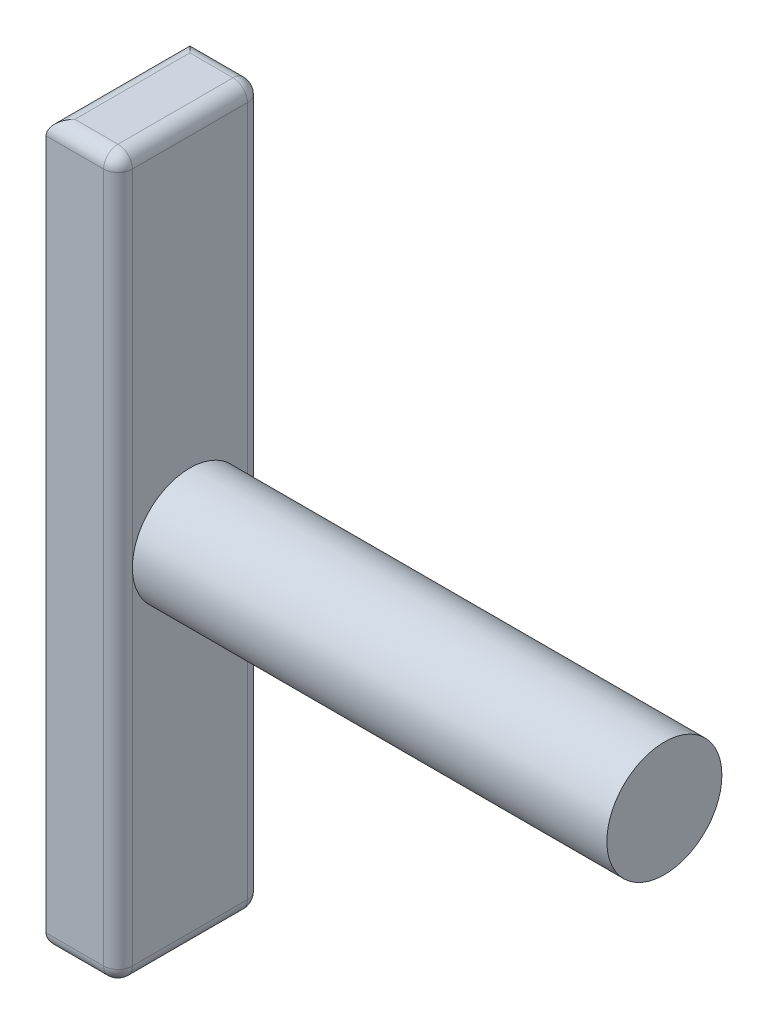
ISO-10303-21;
HEADER;
FILE_DESCRIPTION(('STEP AP214'),'2;1');
FILE_NAME('part.step','',(''),(''),'','','');
FILE_SCHEMA(('AUTOMOTIVE_DESIGN { 1 0 10303 214 1 1 1 1 }'));
ENDSEC;
DATA;
#1=APPLICATION_CONTEXT('core data for automotive mechanical design processes');
#2=APPLICATION_PROTOCOL_DEFINITION('international standard','automotive_design',2000,#1);
#3=PRODUCT_CONTEXT('',#1,'mechanical');
#4=PRODUCT('Part','Part','',(#3));
#5=PRODUCT_RELATED_PRODUCT_CATEGORY('part','',(#4));
#6=PRODUCT_DEFINITION_FORMATION('','',#4);
#7=PRODUCT_DEFINITION_CONTEXT('part definition',#1,'design');
#8=PRODUCT_DEFINITION('design','',#6,#7);
#9=PRODUCT_DEFINITION_SHAPE('','',#8);
#10=(LENGTH_UNIT() NAMED_UNIT(*) SI_UNIT(.MILLI.,.METRE.));
#11=(NAMED_UNIT(*) PLANE_ANGLE_UNIT() SI_UNIT($,.RADIAN.));
#12=(NAMED_UNIT(*) SI_UNIT($,.STERADIAN.) SOLID_ANGLE_UNIT());
#13=UNCERTAINTY_MEASURE_WITH_UNIT(LENGTH_MEASURE(1.E-05),#10,'distance_accuracy_value','');
#14=(GEOMETRIC_REPRESENTATION_CONTEXT(3) GLOBAL_UNCERTAINTY_ASSIGNED_CONTEXT((#13)) GLOBAL_UNIT_ASSIGNED_CONTEXT((#10,
#11,#12)) REPRESENTATION_CONTEXT('',''));
#15=CARTESIAN_POINT('',(0.,0.,0.));
#16=DIRECTION('',(0.,0.,1.));
#17=DIRECTION('',(1.,0.,0.));
#18=AXIS2_PLACEMENT_3D('',#15,#16,#17);
#19=CARTESIAN_POINT('',(50.,0.,0.));
#20=DIRECTION('',(1.,0.,0.));
#21=DIRECTION('',(0.,0.,-1.));
#22=AXIS2_PLACEMENT_3D('',#19,#20,#21);
#23=PLANE('',#22);
#24=DIRECTION('',(0.,1.,0.));
#25=VECTOR('',#24,1.);
#26=CARTESIAN_POINT('',(50.,-10.,-90.));
#27=LINE('',#26,#25);
#28=CARTESIAN_POINT('',(50.,-490.,-90.0000000000001));
#29=VERTEX_POINT('',#28);
#30=CARTESIAN_POINT('',(50.,-250.,-90.));
#31=VERTEX_POINT('',#30);
#32=EDGE_CURVE('E136',#29,#31,#27,.T.);
#33=ORIENTED_EDGE('',*,*,#32,.T.);
#34=CARTESIAN_POINT('',(50.,-250.,-50.));
#35=DIRECTION('',(1.,0.,0.));
#36=DIRECTION('',(0.,0.,-1.));
#37=AXIS2_PLACEMENT_3D('',#34,#35,#36);
#38=CIRCLE('',#37,40.);
#39=CARTESIAN_POINT('',(50.,-250.,-10.));
#40=VERTEX_POINT('',#39);
#41=EDGE_CURVE('E55',#40,#31,#38,.T.);
#42=ORIENTED_EDGE('',*,*,#41,.F.);
#43=DIRECTION('',(0.,-1.,0.));
#44=VECTOR('',#43,1.);
#45=CARTESIAN_POINT('',(50.,-490.,-10.0000000000001));
#46=LINE('',#45,#44);
#47=CARTESIAN_POINT('',(50.,-490.,-10.0000000000001));
#48=VERTEX_POINT('',#47);
#49=EDGE_CURVE('E133',#40,#48,#46,.T.);
#50=ORIENTED_EDGE('',*,*,#49,.T.);
#51=DIRECTION('',(0.,0.,-1.));
#52=VECTOR('',#51,1.);
#53=CARTESIAN_POINT('',(50.,-490.,-100.));
#54=LINE('',#53,#52);
#55=EDGE_CURVE('E214',#48,#29,#54,.T.);
#56=ORIENTED_EDGE('',*,*,#55,.T.);
#57=EDGE_LOOP('',(#33,#42,#50,#56));
#58=FACE_BOUND('',#57,.T.);
#59=ADVANCED_FACE('F39',(#58),#23,.T.);
#60=CARTESIAN_POINT('',(50.,0.,0.));
#61=DIRECTION('',(0.,0.,-1.));
#62=DIRECTION('',(0.,1.,0.));
#63=AXIS2_PLACEMENT_3D('',#60,#61,#62);
#64=PLANE('',#63);
#65=DIRECTION('',(-1.,0.,0.));
#66=VECTOR('',#65,1.);
#67=CARTESIAN_POINT('',(50.,-490.,0.));
#68=LINE('',#67,#66);
#69=CARTESIAN_POINT('',(0.,-490.,0.));
#70=VERTEX_POINT('',#69);
#71=CARTESIAN_POINT('',(40.,-490.,0.));
#72=VERTEX_POINT('',#71);
#73=EDGE_CURVE('E195',#70,#72,#68,.F.);
#74=ORIENTED_EDGE('',*,*,#73,.T.);
#75=DIRECTION('',(0.,-1.,0.));
#76=VECTOR('',#75,1.);
#77=CARTESIAN_POINT('',(40.,-10.,0.));
#78=LINE('',#77,#76);
#79=CARTESIAN_POINT('',(40.,-10.,0.));
#80=VERTEX_POINT('',#79);
#81=EDGE_CURVE('E11',#72,#80,#78,.F.);
#82=ORIENTED_EDGE('',*,*,#81,.T.);
#83=DIRECTION('',(-1.,0.,0.));
#84=VECTOR('',#83,1.);
#85=CARTESIAN_POINT('',(50.,-10.,0.));
#86=LINE('',#85,#84);
#87=CARTESIAN_POINT('',(0.,-10.,0.));
#88=VERTEX_POINT('',#87);
#89=EDGE_CURVE('E197',#80,#88,#86,.T.);
#90=ORIENTED_EDGE('',*,*,#89,.T.);
#91=DIRECTION('',(0.,-1.,0.));
#92=VECTOR('',#91,1.);
#93=CARTESIAN_POINT('',(0.,0.,0.));
#94=LINE('',#93,#92);
#95=EDGE_CURVE('E172',#88,#70,#94,.T.);
#96=ORIENTED_EDGE('',*,*,#95,.T.);
#97=EDGE_LOOP('',(#74,#82,#90,#96));
#98=FACE_BOUND('',#97,.T.);
#99=ADVANCED_FACE('F263',(#98),#64,.F.);
#100=CARTESIAN_POINT('',(50.,-500.,0.));
#101=DIRECTION('',(0.,1.,0.));
#102=DIRECTION('',(0.,0.,1.));
#103=AXIS2_PLACEMENT_3D('',#100,#101,#102);
#104=PLANE('',#103);
#105=DIRECTION('',(-1.,0.,0.));
#106=VECTOR('',#105,1.);
#107=CARTESIAN_POINT('',(50.,-500.,-10.0000000000001));
#108=LINE('',#107,#106);
#109=CARTESIAN_POINT('',(40.,-500.,-10.0000000000001));
#110=VERTEX_POINT('',#109);
#111=CARTESIAN_POINT('',(10.,-500.,-10.0000000000001));
#112=VERTEX_POINT('',#111);
#113=EDGE_CURVE('E202',#110,#112,#108,.T.);
#114=ORIENTED_EDGE('',*,*,#113,.T.);
#115=DIRECTION('',(0.,0.,-1.));
#116=VECTOR('',#115,1.);
#117=CARTESIAN_POINT('',(10.,-500.,0.));
#118=LINE('',#117,#116);
#119=CARTESIAN_POINT('',(10.,-500.,-90.0000000000001));
#120=VERTEX_POINT('',#119);
#121=EDGE_CURVE('E207',#112,#120,#118,.T.);
#122=ORIENTED_EDGE('',*,*,#121,.T.);
#123=DIRECTION('',(-1.,0.,0.));
#124=VECTOR('',#123,1.);
#125=CARTESIAN_POINT('',(50.,-500.,-90.0000000000001));
#126=LINE('',#125,#124);
#127=CARTESIAN_POINT('',(40.,-500.,-90.0000000000001));
#128=VERTEX_POINT('',#127);
#129=EDGE_CURVE('E204',#120,#128,#126,.F.);
#130=ORIENTED_EDGE('',*,*,#129,.T.);
#131=DIRECTION('',(0.,0.,-1.));
#132=VECTOR('',#131,1.);
#133=CARTESIAN_POINT('',(40.,-500.,0.));
#134=LINE('',#133,#132);
#135=EDGE_CURVE('E199',#128,#110,#134,.F.);
#136=ORIENTED_EDGE('',*,*,#135,.T.);
#137=EDGE_LOOP('',(#114,#122,#130,#136));
#138=FACE_BOUND('',#137,.T.);
#139=ADVANCED_FACE('F268',(#138),#104,.F.);
#140=CARTESIAN_POINT('',(50.,0.,-100.));
#141=DIRECTION('',(0.,0.,1.));
#142=DIRECTION('',(0.,-1.,0.));
#143=AXIS2_PLACEMENT_3D('',#140,#141,#142);
#144=PLANE('',#143);
#145=DIRECTION('',(-1.,0.,0.));
#146=VECTOR('',#145,1.);
#147=CARTESIAN_POINT('',(50.,-10.,-100.));
#148=LINE('',#147,#146);
#149=CARTESIAN_POINT('',(0.,-10.,-100.));
#150=VERTEX_POINT('',#149);
#151=CARTESIAN_POINT('',(40.,-10.,-100.));
#152=VERTEX_POINT('',#151);
#153=EDGE_CURVE('E192',#150,#152,#148,.F.);
#154=ORIENTED_EDGE('',*,*,#153,.T.);
#155=DIRECTION('',(0.,1.,0.));
#156=VECTOR('',#155,1.);
#157=CARTESIAN_POINT('',(40.,-490.,-100.));
#158=LINE('',#157,#156);
#159=CARTESIAN_POINT('',(40.,-490.,-100.));
#160=VERTEX_POINT('',#159);
#161=EDGE_CURVE('E48',#152,#160,#158,.F.);
#162=ORIENTED_EDGE('',*,*,#161,.T.);
#163=DIRECTION('',(-1.,0.,0.));
#164=VECTOR('',#163,1.);
#165=CARTESIAN_POINT('',(50.,-490.,-100.));
#166=LINE('',#165,#164);
#167=CARTESIAN_POINT('',(0.,-490.,-100.));
#168=VERTEX_POINT('',#167);
#169=EDGE_CURVE('E190',#160,#168,#166,.T.);
#170=ORIENTED_EDGE('',*,*,#169,.T.);
#171=DIRECTION('',(0.,1.,0.));
#172=VECTOR('',#171,1.);
#173=CARTESIAN_POINT('',(0.,0.,-100.));
#174=LINE('',#173,#172);
#175=EDGE_CURVE('E175',#168,#150,#174,.T.);
#176=ORIENTED_EDGE('',*,*,#175,.T.);
#177=EDGE_LOOP('',(#154,#162,#170,#176));
#178=FACE_BOUND('',#177,.T.);
#179=ADVANCED_FACE('F279',(#178),#144,.F.);
#180=CARTESIAN_POINT('',(50.,0.,0.));
#181=DIRECTION('',(0.,-1.,0.));
#182=DIRECTION('',(0.,0.,-1.));
#183=AXIS2_PLACEMENT_3D('',#180,#181,#182);
#184=PLANE('',#183);
#185=DIRECTION('',(-1.,0.,0.));
#186=VECTOR('',#185,1.);
#187=CARTESIAN_POINT('',(50.,0.,-10.));
#188=LINE('',#187,#186);
#189=CARTESIAN_POINT('',(10.,0.,-10.));
#190=VERTEX_POINT('',#189);
#191=CARTESIAN_POINT('',(40.,0.,-10.));
#192=VERTEX_POINT('',#191);
#193=EDGE_CURVE('E181',#190,#192,#188,.F.);
#194=ORIENTED_EDGE('',*,*,#193,.T.);
#195=DIRECTION('',(0.,0.,1.));
#196=VECTOR('',#195,1.);
#197=CARTESIAN_POINT('',(40.,0.,-100.));
#198=LINE('',#197,#196);
#199=CARTESIAN_POINT('',(40.,0.,-90.));
#200=VERTEX_POINT('',#199);
#201=EDGE_CURVE('E187',#192,#200,#198,.F.);
#202=ORIENTED_EDGE('',*,*,#201,.T.);
#203=DIRECTION('',(-1.,0.,0.));
#204=VECTOR('',#203,1.);
#205=CARTESIAN_POINT('',(50.,0.,-90.));
#206=LINE('',#205,#204);
#207=CARTESIAN_POINT('',(10.,0.,-90.));
#208=VERTEX_POINT('',#207);
#209=EDGE_CURVE('E184',#200,#208,#206,.T.);
#210=ORIENTED_EDGE('',*,*,#209,.T.);
#211=DIRECTION('',(0.,0.,1.));
#212=VECTOR('',#211,1.);
#213=CARTESIAN_POINT('',(10.,0.,0.));
#214=LINE('',#213,#212);
#215=EDGE_CURVE('E179',#208,#190,#214,.T.);
#216=ORIENTED_EDGE('',*,*,#215,.T.);
#217=EDGE_LOOP('',(#194,#202,#210,#216));
#218=FACE_BOUND('',#217,.T.);
#219=ADVANCED_FACE('F245',(#218),#184,.F.);
#220=CARTESIAN_POINT('',(50.,-10.,-10.));
#221=VERTEX_POINT('',#220);
#222=EDGE_CURVE('E142',#221,#40,#46,.T.);
#223=ORIENTED_EDGE('',*,*,#222,.T.);
#224=EDGE_CURVE('E122',#31,#40,#38,.T.);
#225=ORIENTED_EDGE('',*,*,#224,.F.);
#226=CARTESIAN_POINT('',(50.,-10.,-90.));
#227=VERTEX_POINT('',#226);
#228=EDGE_CURVE('E151',#31,#227,#27,.T.);
#229=ORIENTED_EDGE('',*,*,#228,.T.);
#230=DIRECTION('',(0.,0.,1.));
#231=VECTOR('',#230,1.);
#232=CARTESIAN_POINT('',(50.,-10.,0.));
#233=LINE('',#232,#231);
#234=EDGE_CURVE('E150',#227,#221,#233,.T.);
#235=ORIENTED_EDGE('',*,*,#234,.T.);
#236=EDGE_LOOP('',(#223,#225,#229,#235));
#237=FACE_BOUND('',#236,.T.);
#238=ADVANCED_FACE('F148',(#237),#23,.T.);
#239=CARTESIAN_POINT('',(0.,0.,0.));
#240=DIRECTION('',(1.,0.,0.));
#241=DIRECTION('',(0.,0.,-1.));
#242=AXIS2_PLACEMENT_3D('',#239,#240,#241);
#243=PLANE('',#242);
#244=ORIENTED_EDGE('',*,*,#175,.F.);
#245=DIRECTION('',(0.,0.,-1.));
#246=VECTOR('',#245,1.);
#247=CARTESIAN_POINT('',(0.,-490.,0.));
#248=LINE('',#247,#246);
#249=EDGE_CURVE('E211',#168,#70,#248,.F.);
#250=ORIENTED_EDGE('',*,*,#249,.T.);
#251=ORIENTED_EDGE('',*,*,#95,.F.);
#252=DIRECTION('',(0.,0.,1.));
#253=VECTOR('',#252,1.);
#254=CARTESIAN_POINT('',(0.,-10.,0.));
#255=LINE('',#254,#253);
#256=EDGE_CURVE('E209',#88,#150,#255,.F.);
#257=ORIENTED_EDGE('',*,*,#256,.T.);
#258=EDGE_LOOP('',(#244,#250,#251,#257));
#259=FACE_BOUND('',#258,.T.);
#260=ADVANCED_FACE('F273',(#259),#243,.F.);
#261=CARTESIAN_POINT('',(50.,-10.,-10.));
#262=DIRECTION('',(-1.,0.,0.));
#263=DIRECTION('',(0.,0.,1.));
#264=AXIS2_PLACEMENT_3D('',#261,#262,#263);
#265=CYLINDRICAL_SURFACE('',#264,10.);
#266=ORIENTED_EDGE('',*,*,#89,.F.);
#267=CARTESIAN_POINT('',(40.,-10.,-10.));
#268=DIRECTION('',(-1.,0.,0.));
#269=DIRECTION('',(0.,0.,1.));
#270=AXIS2_PLACEMENT_3D('',#267,#268,#269);
#271=CIRCLE('',#270,10.);
#272=EDGE_CURVE('E237',#80,#192,#271,.T.);
#273=ORIENTED_EDGE('',*,*,#272,.T.);
#274=ORIENTED_EDGE('',*,*,#193,.F.);
#275=CARTESIAN_POINT('',(10.,-10.,-10.));
#276=DIRECTION('',(0.707106781186547,0.,0.707106781186547));
#277=DIRECTION('',(-0.707106781186547,0.,0.707106781186547));
#278=AXIS2_PLACEMENT_3D('',#275,#276,#277);
#279=ELLIPSE('',#278,14.1421356237309,10.);
#280=EDGE_CURVE('E176',#88,#190,#279,.F.);
#281=ORIENTED_EDGE('',*,*,#280,.F.);
#282=EDGE_LOOP('',(#266,#273,#274,#281));
#283=FACE_BOUND('',#282,.T.);
#284=ADVANCED_FACE('F241',(#283),#265,.T.);
#285=CARTESIAN_POINT('',(40.,-10.,0.));
#286=DIRECTION('',(0.,0.,-1.));
#287=DIRECTION('',(-1.,0.,0.));
#288=AXIS2_PLACEMENT_3D('',#285,#286,#287);
#289=CYLINDRICAL_SURFACE('',#288,10.);
#290=ORIENTED_EDGE('',*,*,#234,.F.);
#291=CARTESIAN_POINT('',(40.,-10.,-90.));
#292=DIRECTION('',(0.,0.,-1.));
#293=DIRECTION('',(-1.,0.,0.));
#294=AXIS2_PLACEMENT_3D('',#291,#292,#293);
#295=CIRCLE('',#294,10.);
#296=EDGE_CURVE('E236',#227,#200,#295,.F.);
#297=ORIENTED_EDGE('',*,*,#296,.T.);
#298=ORIENTED_EDGE('',*,*,#201,.F.);
#299=CARTESIAN_POINT('',(40.,-10.,-10.));
#300=DIRECTION('',(0.,0.,-1.));
#301=DIRECTION('',(-1.,0.,0.));
#302=AXIS2_PLACEMENT_3D('',#299,#300,#301);
#303=CIRCLE('',#302,10.);
#304=EDGE_CURVE('E234',#192,#221,#303,.T.);
#305=ORIENTED_EDGE('',*,*,#304,.T.);
#306=EDGE_LOOP('',(#290,#297,#298,#305));
#307=FACE_BOUND('',#306,.T.);
#308=ADVANCED_FACE('F249',(#307),#289,.T.);
#309=CARTESIAN_POINT('',(10.,-10.,0.));
#310=DIRECTION('',(0.,0.,1.));
#311=DIRECTION('',(1.,0.,0.));
#312=AXIS2_PLACEMENT_3D('',#309,#310,#311);
#313=CYLINDRICAL_SURFACE('',#312,10.);
#314=ORIENTED_EDGE('',*,*,#280,.T.);
#315=ORIENTED_EDGE('',*,*,#215,.F.);
#316=CARTESIAN_POINT('',(10.,-10.,-90.));
#317=DIRECTION('',(-0.707106781186547,0.,0.707106781186547));
#318=DIRECTION('',(0.707106781186547,0.,0.707106781186547));
#319=AXIS2_PLACEMENT_3D('',#316,#317,#318);
#320=ELLIPSE('',#319,14.1421356237309,10.);
#321=EDGE_CURVE('E217',#150,#208,#320,.F.);
#322=ORIENTED_EDGE('',*,*,#321,.F.);
#323=ORIENTED_EDGE('',*,*,#256,.F.);
#324=EDGE_LOOP('',(#314,#315,#322,#323));
#325=FACE_BOUND('',#324,.T.);
#326=ADVANCED_FACE('F294',(#325),#313,.T.);
#327=CARTESIAN_POINT('',(50.,-10.,-90.));
#328=DIRECTION('',(-1.,0.,0.));
#329=DIRECTION('',(0.,0.,1.));
#330=AXIS2_PLACEMENT_3D('',#327,#328,#329);
#331=CYLINDRICAL_SURFACE('',#330,10.);
#332=ORIENTED_EDGE('',*,*,#209,.F.);
#333=CARTESIAN_POINT('',(40.,-10.,-90.));
#334=DIRECTION('',(-1.,0.,0.));
#335=DIRECTION('',(0.,0.,1.));
#336=AXIS2_PLACEMENT_3D('',#333,#334,#335);
#337=CIRCLE('',#336,10.);
#338=EDGE_CURVE('E232',#200,#152,#337,.T.);
#339=ORIENTED_EDGE('',*,*,#338,.T.);
#340=ORIENTED_EDGE('',*,*,#153,.F.);
#341=ORIENTED_EDGE('',*,*,#321,.T.);
#342=EDGE_LOOP('',(#332,#339,#340,#341));
#343=FACE_BOUND('',#342,.T.);
#344=ADVANCED_FACE('F290',(#343),#331,.T.);
#345=CARTESIAN_POINT('',(50.,-490.,-10.0000000000001));
#346=DIRECTION('',(-1.,0.,0.));
#347=DIRECTION('',(0.,0.,1.));
#348=AXIS2_PLACEMENT_3D('',#345,#346,#347);
#349=CYLINDRICAL_SURFACE('',#348,10.);
#350=ORIENTED_EDGE('',*,*,#113,.F.);
#351=CARTESIAN_POINT('',(40.,-490.,-10.0000000000001));
#352=DIRECTION('',(-1.,0.,0.));
#353=DIRECTION('',(0.,0.,1.));
#354=AXIS2_PLACEMENT_3D('',#351,#352,#353);
#355=CIRCLE('',#354,10.);
#356=EDGE_CURVE('E63',#110,#72,#355,.T.);
#357=ORIENTED_EDGE('',*,*,#356,.T.);
#358=ORIENTED_EDGE('',*,*,#73,.F.);
#359=CARTESIAN_POINT('',(10.,-490.,-10.0000000000001));
#360=DIRECTION('',(-0.707106781186547,0.,-0.707106781186547));
#361=DIRECTION('',(0.707106781186547,0.,-0.707106781186547));
#362=AXIS2_PLACEMENT_3D('',#359,#360,#361);
#363=ELLIPSE('',#362,14.1421356237309,10.);
#364=EDGE_CURVE('E219',#112,#70,#363,.T.);
#365=ORIENTED_EDGE('',*,*,#364,.F.);
#366=EDGE_LOOP('',(#350,#357,#358,#365));
#367=FACE_BOUND('',#366,.T.);
#368=ADVANCED_FACE('F293',(#367),#349,.T.);
#369=CARTESIAN_POINT('',(40.,-490.,0.));
#370=DIRECTION('',(0.,0.,1.));
#371=DIRECTION('',(1.,0.,0.));
#372=AXIS2_PLACEMENT_3D('',#369,#370,#371);
#373=CYLINDRICAL_SURFACE('',#372,10.);
#374=ORIENTED_EDGE('',*,*,#135,.F.);
#375=CARTESIAN_POINT('',(40.,-490.,-90.0000000000001));
#376=DIRECTION('',(0.,0.,1.));
#377=DIRECTION('',(1.,0.,0.));
#378=AXIS2_PLACEMENT_3D('',#375,#376,#377);
#379=CIRCLE('',#378,10.);
#380=EDGE_CURVE('E230',#128,#29,#379,.T.);
#381=ORIENTED_EDGE('',*,*,#380,.T.);
#382=ORIENTED_EDGE('',*,*,#55,.F.);
#383=CARTESIAN_POINT('',(40.,-490.,-10.0000000000001));
#384=DIRECTION('',(0.,0.,1.));
#385=DIRECTION('',(1.,0.,0.));
#386=AXIS2_PLACEMENT_3D('',#383,#384,#385);
#387=CIRCLE('',#386,10.);
#388=EDGE_CURVE('E228',#48,#110,#387,.F.);
#389=ORIENTED_EDGE('',*,*,#388,.T.);
#390=EDGE_LOOP('',(#374,#381,#382,#389));
#391=FACE_BOUND('',#390,.T.);
#392=ADVANCED_FACE('F311',(#391),#373,.T.);
#393=CARTESIAN_POINT('',(10.,-490.,0.));
#394=DIRECTION('',(0.,0.,-1.));
#395=DIRECTION('',(-1.,0.,0.));
#396=AXIS2_PLACEMENT_3D('',#393,#394,#395);
#397=CYLINDRICAL_SURFACE('',#396,10.);
#398=ORIENTED_EDGE('',*,*,#364,.T.);
#399=ORIENTED_EDGE('',*,*,#249,.F.);
#400=CARTESIAN_POINT('',(10.,-490.,-90.0000000000001));
#401=DIRECTION('',(0.707106781186547,0.,-0.707106781186547));
#402=DIRECTION('',(-0.707106781186547,0.,-0.707106781186547));
#403=AXIS2_PLACEMENT_3D('',#400,#401,#402);
#404=ELLIPSE('',#403,14.1421356237309,10.);
#405=EDGE_CURVE('E162',#120,#168,#404,.T.);
#406=ORIENTED_EDGE('',*,*,#405,.F.);
#407=ORIENTED_EDGE('',*,*,#121,.F.);
#408=EDGE_LOOP('',(#398,#399,#406,#407));
#409=FACE_BOUND('',#408,.T.);
#410=ADVANCED_FACE('F307',(#409),#397,.T.);
#411=CARTESIAN_POINT('',(50.,-490.,-90.0000000000001));
#412=DIRECTION('',(-1.,0.,0.));
#413=DIRECTION('',(0.,0.,1.));
#414=AXIS2_PLACEMENT_3D('',#411,#412,#413);
#415=CYLINDRICAL_SURFACE('',#414,10.);
#416=ORIENTED_EDGE('',*,*,#169,.F.);
#417=CARTESIAN_POINT('',(40.,-490.,-90.0000000000001));
#418=DIRECTION('',(-1.,0.,0.));
#419=DIRECTION('',(0.,0.,1.));
#420=AXIS2_PLACEMENT_3D('',#417,#418,#419);
#421=CIRCLE('',#420,10.);
#422=EDGE_CURVE('E216',#160,#128,#421,.T.);
#423=ORIENTED_EDGE('',*,*,#422,.T.);
#424=ORIENTED_EDGE('',*,*,#129,.F.);
#425=ORIENTED_EDGE('',*,*,#405,.T.);
#426=EDGE_LOOP('',(#416,#423,#424,#425));
#427=FACE_BOUND('',#426,.T.);
#428=ADVANCED_FACE('F303',(#427),#415,.T.);
#429=CARTESIAN_POINT('',(40.,-10.,-90.));
#430=DIRECTION('',(0.,0.,1.));
#431=DIRECTION('',(1.,0.,0.));
#432=AXIS2_PLACEMENT_3D('',#429,#430,#431);
#433=SPHERICAL_SURFACE('',#432,10.);
#434=ORIENTED_EDGE('',*,*,#338,.F.);
#435=ORIENTED_EDGE('',*,*,#296,.F.);
#436=CARTESIAN_POINT('',(40.,-10.,-90.));
#437=DIRECTION('',(0.,-1.,0.));
#438=DIRECTION('',(0.,0.,-1.));
#439=AXIS2_PLACEMENT_3D('',#436,#437,#438);
#440=CIRCLE('',#439,10.);
#441=EDGE_CURVE('E160',#152,#227,#440,.T.);
#442=ORIENTED_EDGE('',*,*,#441,.F.);
#443=EDGE_LOOP('',(#434,#435,#442));
#444=FACE_BOUND('',#443,.T.);
#445=ADVANCED_FACE('F306',(#444),#433,.T.);
#446=CARTESIAN_POINT('',(40.,0.,-90.));
#447=DIRECTION('',(0.,-1.,0.));
#448=DIRECTION('',(0.,0.,-1.));
#449=AXIS2_PLACEMENT_3D('',#446,#447,#448);
#450=CYLINDRICAL_SURFACE('',#449,10.);
#451=ORIENTED_EDGE('',*,*,#441,.T.);
#452=ORIENTED_EDGE('',*,*,#228,.F.);
#453=ORIENTED_EDGE('',*,*,#32,.F.);
#454=CARTESIAN_POINT('',(40.,-490.,-90.0000000000001));
#455=DIRECTION('',(0.,-1.,0.));
#456=DIRECTION('',(0.,0.,-1.));
#457=AXIS2_PLACEMENT_3D('',#454,#455,#456);
#458=CIRCLE('',#457,10.);
#459=EDGE_CURVE('E157',#160,#29,#458,.T.);
#460=ORIENTED_EDGE('',*,*,#459,.F.);
#461=ORIENTED_EDGE('',*,*,#161,.F.);
#462=EDGE_LOOP('',(#451,#452,#453,#460,#461));
#463=FACE_BOUND('',#462,.T.);
#464=ADVANCED_FACE('F321',(#463),#450,.T.);
#465=CARTESIAN_POINT('',(40.,-490.,-90.0000000000001));
#466=DIRECTION('',(0.,0.,1.));
#467=DIRECTION('',(1.,0.,0.));
#468=AXIS2_PLACEMENT_3D('',#465,#466,#467);
#469=SPHERICAL_SURFACE('',#468,10.);
#470=ORIENTED_EDGE('',*,*,#459,.T.);
#471=ORIENTED_EDGE('',*,*,#380,.F.);
#472=ORIENTED_EDGE('',*,*,#422,.F.);
#473=EDGE_LOOP('',(#470,#471,#472));
#474=FACE_BOUND('',#473,.T.);
#475=ADVANCED_FACE('F318',(#474),#469,.T.);
#476=CARTESIAN_POINT('',(40.,-490.,-10.0000000000001));
#477=DIRECTION('',(0.,0.,1.));
#478=DIRECTION('',(1.,0.,0.));
#479=AXIS2_PLACEMENT_3D('',#476,#477,#478);
#480=SPHERICAL_SURFACE('',#479,10.);
#481=ORIENTED_EDGE('',*,*,#356,.F.);
#482=ORIENTED_EDGE('',*,*,#388,.F.);
#483=CARTESIAN_POINT('',(40.,-490.,-10.0000000000001));
#484=DIRECTION('',(0.,1.,0.));
#485=DIRECTION('',(0.,0.,1.));
#486=AXIS2_PLACEMENT_3D('',#483,#484,#485);
#487=CIRCLE('',#486,10.);
#488=EDGE_CURVE('E43',#72,#48,#487,.T.);
#489=ORIENTED_EDGE('',*,*,#488,.F.);
#490=EDGE_LOOP('',(#481,#482,#489));
#491=FACE_BOUND('',#490,.T.);
#492=ADVANCED_FACE('F41',(#491),#480,.T.);
#493=CARTESIAN_POINT('',(40.,0.,-10.));
#494=DIRECTION('',(0.,1.,0.));
#495=DIRECTION('',(0.,0.,1.));
#496=AXIS2_PLACEMENT_3D('',#493,#494,#495);
#497=CYLINDRICAL_SURFACE('',#496,10.);
#498=ORIENTED_EDGE('',*,*,#488,.T.);
#499=ORIENTED_EDGE('',*,*,#49,.F.);
#500=ORIENTED_EDGE('',*,*,#222,.F.);
#501=CARTESIAN_POINT('',(40.,-10.,-10.));
#502=DIRECTION('',(0.,1.,0.));
#503=DIRECTION('',(0.,0.,1.));
#504=AXIS2_PLACEMENT_3D('',#501,#502,#503);
#505=CIRCLE('',#504,10.);
#506=EDGE_CURVE('E163',#80,#221,#505,.T.);
#507=ORIENTED_EDGE('',*,*,#506,.F.);
#508=ORIENTED_EDGE('',*,*,#81,.F.);
#509=EDGE_LOOP('',(#498,#499,#500,#507,#508));
#510=FACE_BOUND('',#509,.T.);
#511=ADVANCED_FACE('F140',(#510),#497,.T.);
#512=CARTESIAN_POINT('',(40.,-10.,-10.));
#513=DIRECTION('',(0.,0.,1.));
#514=DIRECTION('',(1.,0.,0.));
#515=AXIS2_PLACEMENT_3D('',#512,#513,#514);
#516=SPHERICAL_SURFACE('',#515,10.);
#517=ORIENTED_EDGE('',*,*,#304,.F.);
#518=ORIENTED_EDGE('',*,*,#272,.F.);
#519=ORIENTED_EDGE('',*,*,#506,.T.);
#520=EDGE_LOOP('',(#517,#518,#519));
#521=FACE_BOUND('',#520,.T.);
#522=ADVANCED_FACE('F251',(#521),#516,.T.);
#523=CARTESIAN_POINT('',(380.,-250.,-50.));
#524=DIRECTION('',(-1.,0.,0.));
#525=DIRECTION('',(0.,0.,1.));
#526=AXIS2_PLACEMENT_3D('',#523,#524,#525);
#527=CYLINDRICAL_SURFACE('',#526,40.);
#528=CARTESIAN_POINT('',(380.,-250.,-50.));
#529=DIRECTION('',(1.,0.,0.));
#530=DIRECTION('',(0.,0.,-1.));
#531=AXIS2_PLACEMENT_3D('',#528,#529,#530);
#532=CIRCLE('',#531,40.);
#533=CARTESIAN_POINT('',(380.,-250.,-90.0000000000001));
#534=VERTEX_POINT('',#533);
#535=EDGE_CURVE('E127',#534,#534,#532,.T.);
#536=ORIENTED_EDGE('',*,*,#535,.F.);
#537=EDGE_LOOP('',(#536));
#538=FACE_BOUND('',#537,.T.);
#539=ORIENTED_EDGE('',*,*,#224,.T.);
#540=ORIENTED_EDGE('',*,*,#41,.T.);
#541=EDGE_LOOP('',(#539,#540));
#542=FACE_BOUND('',#541,.T.);
#543=ADVANCED_FACE('F123',(#538,#542),#527,.T.);
#544=CARTESIAN_POINT('',(380.,-250.,-50.));
#545=DIRECTION('',(1.,0.,0.));
#546=DIRECTION('',(0.,0.,-1.));
#547=AXIS2_PLACEMENT_3D('',#544,#545,#546);
#548=PLANE('',#547);
#549=ORIENTED_EDGE('',*,*,#535,.T.);
#550=EDGE_LOOP('',(#549));
#551=FACE_BOUND('',#550,.T.);
#552=ADVANCED_FACE('F258',(#551),#548,.T.);
#553=CLOSED_SHELL('',(#59,#99,#139,#179,#219,#238,#260,#284,#308,#326,#344,#368,#392,#410,#428,
#445,#464,#475,#492,#511,#522,#543,#552));
#554=MANIFOLD_SOLID_BREP('B2',#553);
#555=ADVANCED_BREP_SHAPE_REPRESENTATION('',(#18,#554),#14);
#556=SHAPE_DEFINITION_REPRESENTATION(#9,#555);
ENDSEC;
END-ISO-10303-21;
